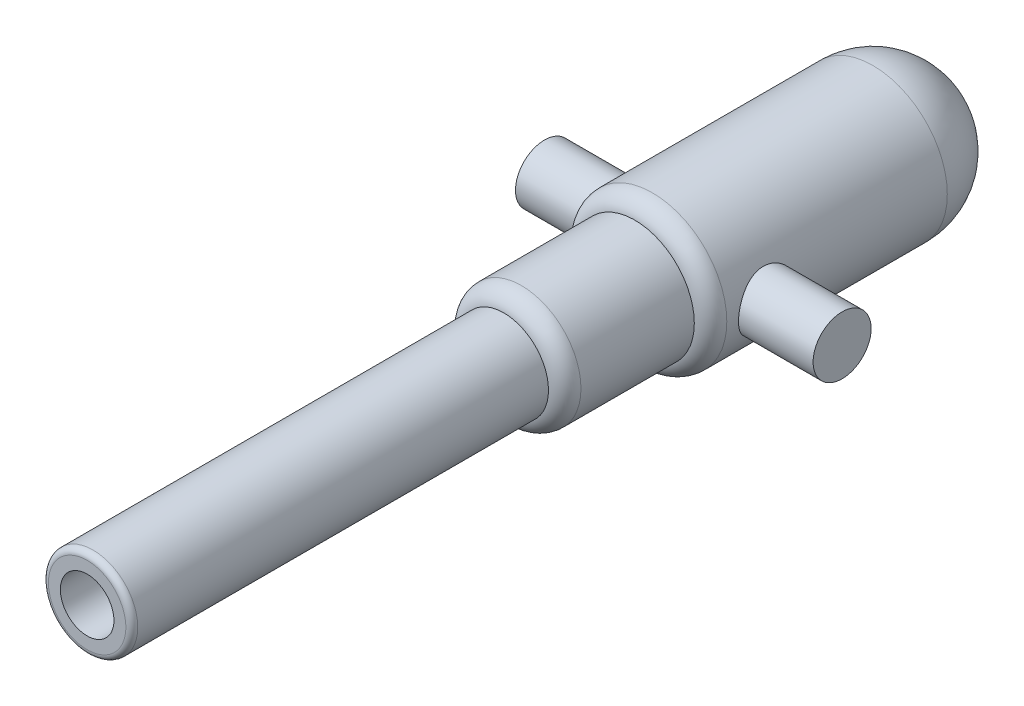
ISO-10303-21;
HEADER;
FILE_DESCRIPTION(('STEP AP214'),'2;1');
FILE_NAME('part.step','',(''),(''),'','','');
FILE_SCHEMA(('AUTOMOTIVE_DESIGN { 1 0 10303 214 1 1 1 1 }'));
ENDSEC;
DATA;
#1=APPLICATION_CONTEXT('core data for automotive mechanical design processes');
#2=APPLICATION_PROTOCOL_DEFINITION('international standard','automotive_design',2000,#1);
#3=PRODUCT_CONTEXT('',#1,'mechanical');
#4=PRODUCT('Part','Part','',(#3));
#5=PRODUCT_RELATED_PRODUCT_CATEGORY('part','',(#4));
#6=PRODUCT_DEFINITION_FORMATION('','',#4);
#7=PRODUCT_DEFINITION_CONTEXT('part definition',#1,'design');
#8=PRODUCT_DEFINITION('design','',#6,#7);
#9=PRODUCT_DEFINITION_SHAPE('','',#8);
#10=(LENGTH_UNIT() NAMED_UNIT(*) SI_UNIT(.MILLI.,.METRE.));
#11=(NAMED_UNIT(*) PLANE_ANGLE_UNIT() SI_UNIT($,.RADIAN.));
#12=(NAMED_UNIT(*) SI_UNIT($,.STERADIAN.) SOLID_ANGLE_UNIT());
#13=UNCERTAINTY_MEASURE_WITH_UNIT(LENGTH_MEASURE(1.E-05),#10,'distance_accuracy_value','');
#14=(GEOMETRIC_REPRESENTATION_CONTEXT(3) GLOBAL_UNCERTAINTY_ASSIGNED_CONTEXT((#13)) GLOBAL_UNIT_ASSIGNED_CONTEXT((#10,
#11,#12)) REPRESENTATION_CONTEXT('',''));
#15=CARTESIAN_POINT('',(0.,0.,0.));
#16=DIRECTION('',(0.,0.,1.));
#17=DIRECTION('',(1.,0.,0.));
#18=AXIS2_PLACEMENT_3D('',#15,#16,#17);
#19=CARTESIAN_POINT('',(0.,7.49999999999998,132.));
#20=DIRECTION('',(0.,0.,-1.));
#21=DIRECTION('',(-1.,0.,0.));
#22=AXIS2_PLACEMENT_3D('',#19,#20,#21);
#23=PLANE('',#22);
#24=CARTESIAN_POINT('',(0.,0.,132.));
#25=DIRECTION('',(0.,0.,-1.));
#26=DIRECTION('',(-1.,0.,0.));
#27=AXIS2_PLACEMENT_3D('',#24,#25,#26);
#28=CIRCLE('',#27,6.49999999999999);
#29=CARTESIAN_POINT('',(-6.49999999999999,0.,132.));
#30=VERTEX_POINT('',#29);
#31=EDGE_CURVE('E46',#30,#30,#28,.F.);
#32=ORIENTED_EDGE('',*,*,#31,.T.);
#33=EDGE_LOOP('',(#32));
#34=FACE_BOUND('',#33,.T.);
#35=CARTESIAN_POINT('',(0.,0.,132.));
#36=DIRECTION('',(0.,0.,1.));
#37=DIRECTION('',(1.,0.,0.));
#38=AXIS2_PLACEMENT_3D('',#35,#36,#37);
#39=CIRCLE('',#38,4.49999999999998);
#40=CARTESIAN_POINT('',(4.49999999999998,0.,132.));
#41=VERTEX_POINT('',#40);
#42=EDGE_CURVE('E138',#41,#41,#39,.T.);
#43=ORIENTED_EDGE('',*,*,#42,.F.);
#44=EDGE_LOOP('',(#43));
#45=FACE_BOUND('',#44,.T.);
#46=ADVANCED_FACE('F39',(#34,#45),#23,.F.);
#47=CARTESIAN_POINT('',(0.,0.,132.));
#48=DIRECTION('',(0.,0.,1.));
#49=DIRECTION('',(1.,0.,0.));
#50=AXIS2_PLACEMENT_3D('',#47,#48,#49);
#51=CYLINDRICAL_SURFACE('',#50,7.49999999999999);
#52=CARTESIAN_POINT('',(0.,0.,131.));
#53=DIRECTION('',(0.,0.,-1.));
#54=DIRECTION('',(-1.,0.,0.));
#55=AXIS2_PLACEMENT_3D('',#52,#53,#54);
#56=CIRCLE('',#55,7.49999999999999);
#57=CARTESIAN_POINT('',(-7.49999999999999,0.,131.));
#58=VERTEX_POINT('',#57);
#59=EDGE_CURVE('E10',#58,#58,#56,.T.);
#60=ORIENTED_EDGE('',*,*,#59,.T.);
#61=EDGE_LOOP('',(#60));
#62=FACE_BOUND('',#61,.T.);
#63=CARTESIAN_POINT('',(0.,0.,62.));
#64=DIRECTION('',(0.,0.,1.));
#65=DIRECTION('',(1.,0.,0.));
#66=AXIS2_PLACEMENT_3D('',#63,#64,#65);
#67=CIRCLE('',#66,7.49999999999999);
#68=CARTESIAN_POINT('',(7.49999999999999,0.,62.));
#69=VERTEX_POINT('',#68);
#70=EDGE_CURVE('E117',#69,#69,#67,.T.);
#71=ORIENTED_EDGE('',*,*,#70,.T.);
#72=EDGE_LOOP('',(#71));
#73=FACE_BOUND('',#72,.T.);
#74=ADVANCED_FACE('F99',(#62,#73),#51,.T.);
#75=CARTESIAN_POINT('',(0.,0.,132.));
#76=DIRECTION('',(0.,0.,1.));
#77=DIRECTION('',(1.,0.,0.));
#78=AXIS2_PLACEMENT_3D('',#75,#76,#77);
#79=CYLINDRICAL_SURFACE('',#78,9.99999999999999);
#80=CARTESIAN_POINT('',(0.,0.,59.0419601084502));
#81=DIRECTION('',(0.,0.,1.));
#82=DIRECTION('',(1.,0.,0.));
#83=AXIS2_PLACEMENT_3D('',#80,#81,#82);
#84=CIRCLE('',#83,9.99999999999999);
#85=CARTESIAN_POINT('',(9.99999999999999,0.,59.0419601084502));
#86=VERTEX_POINT('',#85);
#87=EDGE_CURVE('E49',#86,#86,#84,.F.);
#88=ORIENTED_EDGE('',*,*,#87,.T.);
#89=EDGE_LOOP('',(#88));
#90=FACE_BOUND('',#89,.T.);
#91=CARTESIAN_POINT('',(0.,0.,40.));
#92=DIRECTION('',(0.,0.,1.));
#93=DIRECTION('',(1.,0.,0.));
#94=AXIS2_PLACEMENT_3D('',#91,#92,#93);
#95=CIRCLE('',#94,10.);
#96=CARTESIAN_POINT('',(10.,0.,40.));
#97=VERTEX_POINT('',#96);
#98=EDGE_CURVE('E119',#97,#97,#95,.T.);
#99=ORIENTED_EDGE('',*,*,#98,.T.);
#100=EDGE_LOOP('',(#99));
#101=FACE_BOUND('',#100,.T.);
#102=ADVANCED_FACE('F98',(#90,#101),#79,.T.);
#103=CARTESIAN_POINT('',(0.,0.,132.));
#104=DIRECTION('',(0.,0.,1.));
#105=DIRECTION('',(1.,0.,0.));
#106=AXIS2_PLACEMENT_3D('',#103,#104,#105);
#107=CYLINDRICAL_SURFACE('',#106,12.5);
#108=CARTESIAN_POINT('',(12.5,0.,25.3381575751629));
#109=CARTESIAN_POINT('',(12.4999994597244,-0.129226838972536,25.3211703991597));
#110=CARTESIAN_POINT('',(12.4979905510534,-0.259185516908951,25.3093647696698));
#111=CARTESIAN_POINT('',(12.4898775535801,-0.519561942138447,25.2962041612993));
#112=CARTESIAN_POINT('',(12.4837707889129,-0.649979933969831,25.2948560182969));
#113=CARTESIAN_POINT('',(12.4674780364061,-0.910527070688841,25.3025953336481));
#114=CARTESIAN_POINT('',(12.4572836387743,-1.04065506047694,25.3117043787842));
#115=CARTESIAN_POINT('',(12.4329539413304,-1.29944605129971,25.3402569231002));
#116=CARTESIAN_POINT('',(12.4188170641594,-1.42810844446937,25.3597045615084));
#117=CARTESIAN_POINT('',(12.3868963012593,-1.68261247999733,25.4086240158509));
#118=CARTESIAN_POINT('',(12.3691245157154,-1.80846198276566,25.4380627815141));
#119=CARTESIAN_POINT('',(12.3302366100126,-2.05696943035583,25.506663265585));
#120=CARTESIAN_POINT('',(12.3091192395738,-2.17962616197389,25.5458286220394));
#121=CARTESIAN_POINT('',(12.2413629902609,-2.54145637069845,25.6773262486514));
#122=CARTESIAN_POINT('',(12.1902734123955,-2.77484898664491,25.7837301216748));
#123=CARTESIAN_POINT('',(12.0780913987194,-3.22902944503434,26.0353089074961));
#124=CARTESIAN_POINT('',(12.0166937581669,-3.4490068755474,26.1817978096245));
#125=CARTESIAN_POINT('',(11.8903993949058,-3.86200516215904,26.5077136651735));
#126=CARTESIAN_POINT('',(11.8255007148415,-4.0550107177772,26.6871591815814));
#127=CARTESIAN_POINT('',(11.6936075623931,-4.42152728806899,27.08789333244));
#128=CARTESIAN_POINT('',(11.6267481478334,-4.59297624432979,27.3111350291765));
#129=CARTESIAN_POINT('',(11.5335933617645,-4.8200574486726,27.6667662658331));
#130=CARTESIAN_POINT('',(11.5037161733471,-4.89076679489595,27.7888452488292));
#131=CARTESIAN_POINT('',(11.4472138374616,-5.02158971850734,28.0392495717925));
#132=CARTESIAN_POINT('',(11.4205871146224,-5.0817084350615,28.1675718433722));
#133=CARTESIAN_POINT('',(11.3719157267365,-5.18969922570016,28.4270755624311));
#134=CARTESIAN_POINT('',(11.3497916934938,-5.2377876484485,28.5581521440615));
#135=CARTESIAN_POINT('',(11.3102297645343,-5.32267765976673,28.8245411741977));
#136=CARTESIAN_POINT('',(11.2927896148228,-5.35948467842179,28.9598515501742));
#137=CARTESIAN_POINT('',(11.2632129766332,-5.42136626623145,29.2336237360242));
#138=CARTESIAN_POINT('',(11.2510735418959,-5.44644735347768,29.3720837501123));
#139=CARTESIAN_POINT('',(11.2325430962287,-5.48456279544931,29.6510292526751));
#140=CARTESIAN_POINT('',(11.2261515112001,-5.49759835329317,29.7915145374402));
#141=CARTESIAN_POINT('',(11.2196856668002,-5.51078004946016,30.0598083721302));
#142=CARTESIAN_POINT('',(11.2190680158967,-5.51203493370522,30.187550773587));
#143=CARTESIAN_POINT('',(11.2227579904903,-5.50451831612154,30.4427134883956));
#144=CARTESIAN_POINT('',(11.2270672242806,-5.49574354029019,30.5701336829577));
#145=CARTESIAN_POINT('',(11.2404729555602,-5.46827206844951,30.8235912086965));
#146=CARTESIAN_POINT('',(11.2495676013329,-5.44957921022185,30.9496290555288));
#147=CARTESIAN_POINT('',(11.2722616971408,-5.40248073501962,31.1995087574529));
#148=CARTESIAN_POINT('',(11.2858628792094,-5.3740713834912,31.3233497488994));
#149=CARTESIAN_POINT('',(11.3167403370463,-5.30873391127403,31.5646582466844));
#150=CARTESIAN_POINT('',(11.3339076493822,-5.27205609886384,31.6822075696039));
#151=CARTESIAN_POINT('',(11.3716585017226,-5.19012654900064,31.9137290997309));
#152=CARTESIAN_POINT('',(11.3922432260962,-5.14487183828767,32.0277000504447));
#153=CARTESIAN_POINT('',(11.4583532922518,-4.9967839280586,32.3632768653571));
#154=CARTESIAN_POINT('',(11.5082561126269,-4.88158315603705,32.5787067781774));
#155=CARTESIAN_POINT('',(11.619473573769,-4.61095297204907,33.0052076968856));
#156=CARTESIAN_POINT('',(11.6813841823322,-4.45302718832601,33.2145236564944));
#157=CARTESIAN_POINT('',(11.8078074883167,-4.10605422073201,33.604978120563));
#158=CARTESIAN_POINT('',(11.8723214198585,-3.9169921425007,33.7861030585137));
#159=CARTESIAN_POINT('',(11.969202611314,-3.60572300907301,34.0397118398778));
#160=CARTESIAN_POINT('',(12.0026407593194,-3.49302534900618,34.1237048207036));
#161=CARTESIAN_POINT('',(12.0678824647639,-3.26048571842857,34.2818337991373));
#162=CARTESIAN_POINT('',(12.0996866075066,-3.14064633978999,34.3559733415794));
#163=CARTESIAN_POINT('',(12.1609212130946,-2.89449311015712,34.4938401059582));
#164=CARTESIAN_POINT('',(12.1903509036671,-2.76817717438356,34.5575639471243));
#165=CARTESIAN_POINT('',(12.2461218580143,-2.50996634180787,34.6739759969793));
#166=CARTESIAN_POINT('',(12.272464566413,-2.37807409420981,34.7266693767768));
#167=CARTESIAN_POINT('',(12.3208990524423,-2.11263582598567,34.8194418084597));
#168=CARTESIAN_POINT('',(12.3430740137156,-1.9791959647019,34.8597809289627));
#169=CARTESIAN_POINT('',(12.3833986325649,-1.70883202868704,34.9289680525723));
#170=CARTESIAN_POINT('',(12.4015500742392,-1.57190952836341,34.9578211533148));
#171=CARTESIAN_POINT('',(12.433450973,-1.29561954731249,35.0036871318749));
#172=CARTESIAN_POINT('',(12.4472014554766,-1.15625264410628,35.0207027688179));
#173=CARTESIAN_POINT('',(12.470044821386,-0.876193659938018,35.0426470455143));
#174=CARTESIAN_POINT('',(12.4791380051482,-0.73550166502149,35.047576464734));
#175=CARTESIAN_POINT('',(12.4920699791984,-0.464028032443197,35.0453140593877));
#176=CARTESIAN_POINT('',(12.4962368930579,-0.333254283511071,35.0389605897774));
#177=CARTESIAN_POINT('',(12.5004696627911,-0.0725305873693478,35.0157391287691));
#178=CARTESIAN_POINT('',(12.5005341517267,0.0574190708300672,34.9988676346303));
#179=CARTESIAN_POINT('',(12.496685510731,0.31542024633806,34.9547416807325));
#180=CARTESIAN_POINT('',(12.4927741896331,0.443472599963976,34.9274919461807));
#181=CARTESIAN_POINT('',(12.4812052069073,0.696857661971225,34.8628247605715));
#182=CARTESIAN_POINT('',(12.473546135218,0.822189328165207,34.8254034849102));
#183=CARTESIAN_POINT('',(12.4549792961256,1.06689125418272,34.7415037843037));
#184=CARTESIAN_POINT('',(12.4441353638004,1.18632930976024,34.6952090155042));
#185=CARTESIAN_POINT('',(12.4195336871626,1.42096072887096,34.5934976201856));
#186=CARTESIAN_POINT('',(12.4057749089489,1.53615256919845,34.5380777585377));
#187=CARTESIAN_POINT('',(12.3607746687488,1.87423836946384,34.3587375563957));
#188=CARTESIAN_POINT('',(12.3257934791538,2.08983617387784,34.221669835569));
#189=CARTESIAN_POINT('',(12.2481528769978,2.50595214749395,33.9090307917687));
#190=CARTESIAN_POINT('',(12.2052075575475,2.70526663077226,33.7319391185408));
#191=CARTESIAN_POINT('',(12.1180042761095,3.07239432473198,33.3478197296124));
#192=CARTESIAN_POINT('',(12.0737458698894,3.24019673048771,33.1407817887921));
#193=CARTESIAN_POINT('',(11.9873924261093,3.54667850493966,32.6920629056526));
#194=CARTESIAN_POINT('',(11.9454729759602,3.6837900016405,32.4492730768139));
#195=CARTESIAN_POINT('',(11.8716964383452,3.9150547198657,31.9426042092476));
#196=CARTESIAN_POINT('',(11.8398365910524,4.00921972680856,31.6787309796352));
#197=CARTESIAN_POINT('',(11.7914772619379,4.14927315944983,31.1446036141269));
#198=CARTESIAN_POINT('',(11.7745929634391,4.19637523222956,30.8747040866559));
#199=CARTESIAN_POINT('',(11.7572731348476,4.24467197143962,30.3303460923893));
#200=CARTESIAN_POINT('',(11.7568318285848,4.24588275877488,30.0558892604005));
#201=CARTESIAN_POINT('',(11.7720441162792,4.20349629131691,29.5249187891053));
#202=CARTESIAN_POINT('',(11.7868884713428,4.16215199469008,29.2681974793152));
#203=CARTESIAN_POINT('',(11.8294389074607,4.03962105287876,28.7655746708951));
#204=CARTESIAN_POINT('',(11.8571469711693,3.95842826582611,28.5196748465546));
#205=CARTESIAN_POINT('',(11.9224140548328,3.75730096551356,28.041257709826));
#206=CARTESIAN_POINT('',(11.9601159984523,3.63679798438447,27.8089996775273));
#207=CARTESIAN_POINT('',(12.0405798398751,3.36081584419462,27.3673157780759));
#208=CARTESIAN_POINT('',(12.0833427508106,3.20532967637435,27.1578944986867));
#209=CARTESIAN_POINT('',(12.1713464162943,2.85355872164059,26.7557394209411));
#210=CARTESIAN_POINT('',(12.2165955938819,2.65551660144719,26.5645299182113));
#211=CARTESIAN_POINT('',(12.2802508191089,2.33608940462232,26.3044174060929));
#212=CARTESIAN_POINT('',(12.3007823954991,2.22577903743012,26.2221026803681));
#213=CARTESIAN_POINT('',(12.3397672802885,1.99835539436917,26.0669511504512));
#214=CARTESIAN_POINT('',(12.3582214518886,1.8812449749413,25.9941104076706));
#215=CARTESIAN_POINT('',(12.3924855637603,1.64047371343002,25.8581908408109));
#216=CARTESIAN_POINT('',(12.4082842031198,1.51678768503403,25.7951538184922));
#217=CARTESIAN_POINT('',(12.4365542307122,1.26421990341541,25.6797619218649));
#218=CARTESIAN_POINT('',(12.4490271036679,1.13534049835377,25.6274022833124));
#219=CARTESIAN_POINT('',(12.4701225420702,0.873634619935997,25.5339301786789));
#220=CARTESIAN_POINT('',(12.4787547694952,0.740818958260319,25.4927895908399));
#221=CARTESIAN_POINT('',(12.4918078911273,0.472029113594252,25.4219902806105));
#222=CARTESIAN_POINT('',(12.4962319743048,0.336057402466485,25.3923228738718));
#223=CARTESIAN_POINT('',(12.4989413694362,0.166019843566311,25.3627793942062));
#224=CARTESIAN_POINT('',(12.4993376429333,0.132890129883392,25.3573755232544));
#225=CARTESIAN_POINT('',(12.4998670314448,0.066523130927692,25.3472523559209));
#226=CARTESIAN_POINT('',(12.5000001391625,0.033285842697772,25.3425330785244));
#227=CARTESIAN_POINT('',(12.5,0.,25.3381575751629));
#228=B_SPLINE_CURVE_WITH_KNOTS('',3,(#108,#109,#110,#111,#112,#113,#114,#115,#116,#117,#118,
#119,#120,#121,#122,#123,#124,#125,#126,#127,#128,#129,#130,#131,#132,#133,#134,#135,#136,#137,
#138,#139,#140,#141,#142,#143,#144,#145,#146,#147,#148,#149,#150,#151,#152,#153,#154,#155,#156,
#157,#158,#159,#160,#161,#162,#163,#164,#165,#166,#167,#168,#169,#170,#171,#172,#173,#174,#175,
#176,#177,#178,#179,#180,#181,#182,#183,#184,#185,#186,#187,#188,#189,#190,#191,#192,#193,#194,
#195,#196,#197,#198,#199,#200,#201,#202,#203,#204,#205,#206,#207,#208,#209,#210,#211,#212,#213,
#214,#215,#216,#217,#218,#219,#220,#221,#222,#223,#224,#225,#226,#227),.UNSPECIFIED.,.T.,.F.,(4,
2,2,2,2,2,2,2,2,2,2,2,2,2,2,2,2,2,2,2,2,2,2,2,2,2,2,2,2,2,2,2,2,2,2,2,2,2,2,2,2,2,2,2,2,2,2,2,2,
2,2,2,2,2,2,2,2,2,2,4),(0.,0.390981668001859,0.78221889244213,1.17426520270685,1.56646859358783,
1.95738703536964,2.34845191357281,3.12948834955925,3.94006011707391,4.75108985148657,
5.61446222423409,6.04663007437252,6.47858763132611,6.90210459388154,7.32541738346282,
7.7484945856333,8.171529525898,8.55429906082968,8.93719357970137,9.31994004625912,
9.70283378782229,10.0754049745614,10.4481055535206,11.1930101526671,11.9980342131282,
12.8034444895192,13.2364398862315,13.6692790861069,14.1022585008805,14.5350344769447,
14.9579493450719,15.3806763085937,15.803304708112,16.2259058506936,16.6184062530595,
17.0110374368413,17.4034900691569,17.7960904723207,18.181304151712,18.5666546965442,
19.3367468822825,20.1434392477604,20.950407710544,21.7921742426247,22.6337096370977,
23.4529356909605,24.2718739606034,25.0495797377532,25.827405420753,26.617018727879,
27.4067903723694,28.2394604132957,28.6565325403842,29.0734307214053,29.4920604493885,
29.9105029742729,30.3278867801145,30.7449540360657,30.8456590720492,30.946366900255),.UNSPECIFIED.);
#229=CARTESIAN_POINT('',(12.5,0.,25.3381575751629));
#230=VERTEX_POINT('',#229);
#231=EDGE_CURVE('E60',#230,#230,#228,.T.);
#232=ORIENTED_EDGE('',*,*,#231,.T.);
#233=EDGE_LOOP('',(#232));
#234=FACE_BOUND('',#233,.T.);
#235=CARTESIAN_POINT('',(-12.4838406935988,-0.635390853606489,25.2965728752538));
#236=CARTESIAN_POINT('',(-12.4904556713871,-0.505412139555741,25.2965736003361));
#237=CARTESIAN_POINT('',(-12.495038744393,-0.375280911729329,25.3017781315438));
#238=CARTESIAN_POINT('',(-12.5001392354246,-0.115715806595469,25.3226004446549));
#239=CARTESIAN_POINT('',(-12.5006540237285,0.0137175656209384,25.3382249549144));
#240=CARTESIAN_POINT('',(-12.4977229965279,0.271144570874731,25.3798248331102));
#241=CARTESIAN_POINT('',(-12.4942690073285,0.399134682478056,25.405821490389));
#242=CARTESIAN_POINT('',(-12.4836018752876,0.652514583572436,25.4679623818925));
#243=CARTESIAN_POINT('',(-12.4763872295543,0.777903312612416,25.5041106704031));
#244=CARTESIAN_POINT('',(-12.4585345925842,1.02478188365609,25.5861273532564));
#245=CARTESIAN_POINT('',(-12.4479072525727,1.14628257978126,25.6319653552776));
#246=CARTESIAN_POINT('',(-12.4236143263625,1.38500451846538,25.73305292795));
#247=CARTESIAN_POINT('',(-12.4099476030955,1.50222414026756,25.7883060190811));
#248=CARTESIAN_POINT('',(-12.3650701408506,1.84615507941922,25.9675011746057));
#249=CARTESIAN_POINT('',(-12.3299549790499,2.06548519240017,26.1049950373328));
#250=CARTESIAN_POINT('',(-12.2523010865487,2.48564046410375,26.4171549267975));
#251=CARTESIAN_POINT('',(-12.2095571263636,2.68562580985688,26.5928896112891));
#252=CARTESIAN_POINT('',(-12.1225591171208,3.05441941037382,26.9745048371584));
#253=CARTESIAN_POINT('',(-12.0783044557223,3.22321484063623,27.1803977167192));
#254=CARTESIAN_POINT('',(-12.0138553633235,3.45311673528246,27.5128068508752));
#255=CARTESIAN_POINT('',(-11.9922582479076,3.52717079980072,27.6303080492907));
#256=CARTESIAN_POINT('',(-11.950826403208,3.66509569941948,27.8714210617199));
#257=CARTESIAN_POINT('',(-11.9309909980385,3.72897044738334,27.9950305037112));
#258=CARTESIAN_POINT('',(-11.8937673669754,3.84604697170585,28.2475862782362));
#259=CARTESIAN_POINT('',(-11.8763796564707,3.89924650128039,28.3765337273714));
#260=CARTESIAN_POINT('',(-11.8446896003166,3.99447716484654,28.6387987365597));
#261=CARTESIAN_POINT('',(-11.8303858598779,4.03651334969358,28.772114289487));
#262=CARTESIAN_POINT('',(-11.8057014515689,4.10813995370401,29.0388198530282));
#263=CARTESIAN_POINT('',(-11.7952320029605,4.1380140957391,29.1721254264754));
#264=CARTESIAN_POINT('',(-11.7781159259837,4.18648393265259,29.4409605561998));
#265=CARTESIAN_POINT('',(-11.7714677014391,4.20508433689813,29.5764891595198));
#266=CARTESIAN_POINT('',(-11.7622388492292,4.23083031338338,29.8487536420786));
#267=CARTESIAN_POINT('',(-11.7596577666973,4.2379771665822,29.9854893845914));
#268=CARTESIAN_POINT('',(-11.7586607568188,4.2407428918501,30.2590900340619));
#269=CARTESIAN_POINT('',(-11.7602446824097,4.23636217094721,30.3959549362885));
#270=CARTESIAN_POINT('',(-11.7673298735739,4.21663943814865,30.6617442850613));
#271=CARTESIAN_POINT('',(-11.7726267964856,4.20186907286246,30.7907170604826));
#272=CARTESIAN_POINT('',(-11.786735351013,4.16212848848435,31.0469280876284));
#273=CARTESIAN_POINT('',(-11.7955481632626,4.13715484306821,31.1741657418422));
#274=CARTESIAN_POINT('',(-11.8163933732626,4.07723599715207,31.4259695412345));
#275=CARTESIAN_POINT('',(-11.8284249074806,4.04229347097915,31.5505363932796));
#276=CARTESIAN_POINT('',(-11.8553142319127,3.96273622118073,31.7962443056449));
#277=CARTESIAN_POINT('',(-11.8701731022335,3.9181178002308,31.9173840363449));
#278=CARTESIAN_POINT('',(-11.9187420384117,3.76891110169501,32.2777075351918));
#279=CARTESIAN_POINT('',(-11.956157630835,3.6497468175885,32.5105483894963));
#280=CARTESIAN_POINT('',(-12.0362074456665,3.37637714888558,32.9535207475384));
#281=CARTESIAN_POINT('',(-12.0788432934737,3.22216083748824,33.1636451396475));
#282=CARTESIAN_POINT('',(-12.1667678644494,2.8729540040032,33.5674786257397));
#283=CARTESIAN_POINT('',(-12.2120740852076,2.67619403439611,33.7596602224037));
#284=CARTESIAN_POINT('',(-12.2972783187395,2.25246143460713,34.1087415835048));
#285=CARTESIAN_POINT('',(-12.3371760206977,2.02548706955545,34.265639320598));
#286=CARTESIAN_POINT('',(-12.4063876292586,1.54607535453546,34.5400240303445));
#287=CARTESIAN_POINT('',(-12.4356594486361,1.29354170860635,34.6573541553194));
#288=CARTESIAN_POINT('',(-12.4789443905752,0.77104437676312,34.8475502560872));
#289=CARTESIAN_POINT('',(-12.492964500218,0.501088732273862,34.9204365856471));
#290=CARTESIAN_POINT('',(-12.5026514032372,-0.0326828152323721,35.0163504499959));
#291=CARTESIAN_POINT('',(-12.4992746612975,-0.296034466207802,35.0418734472789));
#292=CARTESIAN_POINT('',(-12.4756851618254,-0.822617331403068,35.0500853846972));
#293=CARTESIAN_POINT('',(-12.4554748727356,-1.08584855761963,35.0327806042917));
#294=CARTESIAN_POINT('',(-12.4001326402504,-1.59721358129429,34.9575416191449));
#295=CARTESIAN_POINT('',(-12.3654286049026,-1.84556357216712,34.9007437188156));
#296=CARTESIAN_POINT('',(-12.2836410442436,-2.32856693105758,34.7500905624531));
#297=CARTESIAN_POINT('',(-12.2365552696965,-2.563217801053,34.6562285718934));
#298=CARTESIAN_POINT('',(-12.131173172961,-3.02372394429368,34.4295361961517));
#299=CARTESIAN_POINT('',(-12.0724710281355,-3.24872232186301,34.2951567376692));
#300=CARTESIAN_POINT('',(-11.9500677004362,-3.67353403891935,33.9930084802113));
#301=CARTESIAN_POINT('',(-11.886364213276,-3.87333565760833,33.8252242351987));
#302=CARTESIAN_POINT('',(-11.7547988361835,-4.25658367641108,33.4472096733979));
#303=CARTESIAN_POINT('',(-11.6869520153664,-4.43796260688953,33.234854818549));
#304=CARTESIAN_POINT('',(-11.5906041740214,-4.68140624631176,32.8946074485749));
#305=CARTESIAN_POINT('',(-11.5593738926326,-4.75782266075944,32.7774913730524));
#306=CARTESIAN_POINT('',(-11.4995861651321,-4.90056028192241,32.5366347175396));
#307=CARTESIAN_POINT('',(-11.4710275047463,-4.96688608357517,32.4128971876528));
#308=CARTESIAN_POINT('',(-11.4175059962435,-5.0887110723098,32.1598487353626));
#309=CARTESIAN_POINT('',(-11.3925344466843,-5.14423657830732,32.0305523234428));
#310=CARTESIAN_POINT('',(-11.3469222567405,-5.24407939862449,31.7670208543385));
#311=CARTESIAN_POINT('',(-11.3262795812997,-5.28840198159524,31.632788152806));
#312=CARTESIAN_POINT('',(-11.2900436484373,-5.36532617169036,31.3604172191281));
#313=CARTESIAN_POINT('',(-11.2744474976735,-5.39793449617909,31.2222812744197));
#314=CARTESIAN_POINT('',(-11.2488720111282,-5.45103219698156,30.9431905655546));
#315=CARTESIAN_POINT('',(-11.2388920688456,-5.47152288190581,30.8022361074756));
#316=CARTESIAN_POINT('',(-11.2255772560534,-5.49878344762201,30.5318145151358));
#317=CARTESIAN_POINT('',(-11.22171610544,-5.50664097541377,30.4024817967111));
#318=CARTESIAN_POINT('',(-11.2190699114718,-5.51203058476903,30.1435023491708));
#319=CARTESIAN_POINT('',(-11.2202865403807,-5.5095592647355,30.0138555306632));
#320=CARTESIAN_POINT('',(-11.227758077188,-5.49431699996822,29.7553822672614));
#321=CARTESIAN_POINT('',(-11.234010495899,-5.48155114381262,29.6265554487436));
#322=CARTESIAN_POINT('',(-11.2513476871422,-5.44587615574511,29.3705977654933));
#323=CARTESIAN_POINT('',(-11.2624342953865,-5.42296317055933,29.2434675639449));
#324=CARTESIAN_POINT('',(-11.2884864301119,-5.3685138641897,28.9975614827472));
#325=CARTESIAN_POINT('',(-11.3032540036095,-5.33741407624805,28.8786677040832));
#326=CARTESIAN_POINT('',(-11.336464372761,-5.2665074547809,28.644016906501));
#327=CARTESIAN_POINT('',(-11.3549084316993,-5.22669762792175,28.5282609813609));
#328=CARTESIAN_POINT('',(-11.4150475620875,-5.09471163411512,28.1867402279716));
#329=CARTESIAN_POINT('',(-11.4615684788221,-4.98994120514739,27.966554008105));
#330=CARTESIAN_POINT('',(-11.5666240762398,-4.74157552050007,27.5311033056615));
#331=CARTESIAN_POINT('',(-11.6257698951164,-4.59578411495976,27.3172501468443));
#332=CARTESIAN_POINT('',(-11.7482355015239,-4.27303044735824,26.9158713175878));
#333=CARTESIAN_POINT('',(-11.8115568347765,-4.09605660096241,26.7283554782006));
#334=CARTESIAN_POINT('',(-11.942301021431,-3.69845973642234,26.3688379424397));
#335=CARTESIAN_POINT('',(-12.0096256747784,-3.47542769830342,26.1994331826888));
#336=CARTESIAN_POINT('',(-12.1048280209788,-3.12062005440072,25.975272831145));
#337=CARTESIAN_POINT('',(-12.1356224829998,-2.99885858457035,25.9054958464596));
#338=CARTESIAN_POINT('',(-12.1945821193644,-2.74928407585095,25.776487226759));
#339=CARTESIAN_POINT('',(-12.2227484699752,-2.62147378322273,25.7172508631918));
#340=CARTESIAN_POINT('',(-12.2756288700004,-2.36144787965335,25.6102131249247));
#341=CARTESIAN_POINT('',(-12.300363638408,-2.22926526493515,25.5623417591918));
#342=CARTESIAN_POINT('',(-12.3460177729246,-1.96070888056114,25.4780723753239));
#343=CARTESIAN_POINT('',(-12.3669389352103,-1.8243371195089,25.4416689499706));
#344=CARTESIAN_POINT('',(-12.4044608685085,-1.54875522393969,25.3808260813251));
#345=CARTESIAN_POINT('',(-12.4210728674132,-1.40955350603785,25.3563553966737));
#346=CARTESIAN_POINT('',(-12.449692152096,-1.12915628088505,25.3195850484128));
#347=CARTESIAN_POINT('',(-12.4617030437156,-0.98796242520435,25.3072758419788));
#348=CARTESIAN_POINT('',(-12.4736956315297,-0.811271759583763,25.2996194938797));
#349=CARTESIAN_POINT('',(-12.4759320670516,-0.776118934768419,25.2984775303959));
#350=CARTESIAN_POINT('',(-12.4801089093854,-0.705778086748445,25.296954112483));
#351=CARTESIAN_POINT('',(-12.4820493080831,-0.670590062605619,25.2965726788961));
#352=CARTESIAN_POINT('',(-12.4838406935988,-0.635390853606489,25.2965728752538));
#353=B_SPLINE_CURVE_WITH_KNOTS('',3,(#235,#236,#237,#238,#239,#240,#241,#242,#243,#244,#245,
#246,#247,#248,#249,#250,#251,#252,#253,#254,#255,#256,#257,#258,#259,#260,#261,#262,#263,#264,
#265,#266,#267,#268,#269,#270,#271,#272,#273,#274,#275,#276,#277,#278,#279,#280,#281,#282,#283,
#284,#285,#286,#287,#288,#289,#290,#291,#292,#293,#294,#295,#296,#297,#298,#299,#300,#301,#302,
#303,#304,#305,#306,#307,#308,#309,#310,#311,#312,#313,#314,#315,#316,#317,#318,#319,#320,#321,
#322,#323,#324,#325,#326,#327,#328,#329,#330,#331,#332,#333,#334,#335,#336,#337,#338,#339,#340,
#341,#342,#343,#344,#345,#346,#347,#348,#349,#350,#351,#352),.UNSPECIFIED.,.T.,.F.,(4,2,2,2,2,2,
2,2,2,2,2,2,2,2,2,2,2,2,2,2,2,2,2,2,2,2,2,2,2,2,2,2,2,2,2,2,2,2,2,2,2,2,2,2,2,2,2,2,2,2,2,2,2,2,
2,2,2,2,4),(0.,0.390405205015054,0.781062745649908,1.17252628952777,1.5641463962009,
1.95455592227975,2.34511175149461,3.12513680495369,3.93067279664783,4.73653927082414,
5.15779337412619,5.5788851574542,6.00006547407944,6.42105490173997,6.83156632181819,
7.24190614097414,7.65220006473763,8.06247950159472,8.45179057890459,8.84123249686139,
9.23057003827631,9.62005661517884,10.4089630091952,11.1981156678438,12.0304523874065,
12.8628369192509,13.6984833032777,14.5337467013095,15.3235948588911,16.1133272148671,
16.8812297202165,17.6492718173131,18.4515131124803,19.2541262210867,20.1118946859696,
20.5413234543776,20.9705560857627,21.3987292556049,21.8267006825517,22.2544263025355,
22.6821057230514,23.0704916538287,23.4590055017305,23.8473274252827,24.2357969369357,
24.6067095769055,24.9777498872716,25.7193155329358,26.5125390263051,27.3060578273962,
28.1657353951847,28.5963298289539,29.0267306071875,29.4544077102171,29.8818828574729,
30.3082327325375,30.7342477945972,30.8399695500723,30.9456942028051),.UNSPECIFIED.);
#354=CARTESIAN_POINT('',(-12.4838406935988,-0.635390853606489,25.2965728752538));
#355=VERTEX_POINT('',#354);
#356=EDGE_CURVE('E66',#355,#355,#353,.T.);
#357=ORIENTED_EDGE('',*,*,#356,.T.);
#358=EDGE_LOOP('',(#357));
#359=FACE_BOUND('',#358,.T.);
#360=CARTESIAN_POINT('',(0.,0.,37.0419601084502));
#361=DIRECTION('',(0.,0.,1.));
#362=DIRECTION('',(1.,0.,0.));
#363=AXIS2_PLACEMENT_3D('',#360,#361,#362);
#364=CIRCLE('',#363,12.5);
#365=CARTESIAN_POINT('',(12.5,0.,37.0419601084502));
#366=VERTEX_POINT('',#365);
#367=EDGE_CURVE('E53',#366,#366,#364,.F.);
#368=ORIENTED_EDGE('',*,*,#367,.T.);
#369=EDGE_LOOP('',(#368));
#370=FACE_BOUND('',#369,.T.);
#371=CARTESIAN_POINT('',(0.,0.,0.));
#372=DIRECTION('',(0.,0.,1.));
#373=DIRECTION('',(1.,0.,0.));
#374=AXIS2_PLACEMENT_3D('',#371,#372,#373);
#375=CIRCLE('',#374,12.5);
#376=CARTESIAN_POINT('',(12.5,0.,0.));
#377=VERTEX_POINT('',#376);
#378=EDGE_CURVE('E63',#377,#377,#375,.T.);
#379=ORIENTED_EDGE('',*,*,#378,.T.);
#380=EDGE_LOOP('',(#379));
#381=FACE_BOUND('',#380,.T.);
#382=ADVANCED_FACE('F69',(#234,#359,#370,#381),#107,.T.);
#383=CARTESIAN_POINT('',(0.,0.,0.));
#384=DIRECTION('',(0.,0.,1.));
#385=DIRECTION('',(0.,1.,0.));
#386=AXIS2_PLACEMENT_3D('',#383,#384,#385);
#387=SPHERICAL_SURFACE('',#386,12.5);
#388=ORIENTED_EDGE('',*,*,#378,.F.);
#389=EDGE_LOOP('',(#388));
#390=FACE_BOUND('',#389,.T.);
#391=ADVANCED_FACE('F84',(#390),#387,.T.);
#392=CARTESIAN_POINT('',(0.,0.,37.0419601084502));
#393=DIRECTION('',(0.,0.,1.));
#394=DIRECTION('',(1.,0.,0.));
#395=AXIS2_PLACEMENT_3D('',#392,#393,#394);
#396=TOROIDAL_SURFACE('',#395,9.5,3.);
#397=ORIENTED_EDGE('',*,*,#367,.F.);
#398=EDGE_LOOP('',(#397));
#399=FACE_BOUND('',#398,.T.);
#400=ORIENTED_EDGE('',*,*,#98,.F.);
#401=EDGE_LOOP('',(#400));
#402=FACE_BOUND('',#401,.T.);
#403=ADVANCED_FACE('F86',(#399,#402),#396,.T.);
#404=CARTESIAN_POINT('',(0.,0.,59.0419601084502));
#405=DIRECTION('',(0.,0.,1.));
#406=DIRECTION('',(1.,0.,0.));
#407=AXIS2_PLACEMENT_3D('',#404,#405,#406);
#408=TOROIDAL_SURFACE('',#407,6.99999999999999,3.);
#409=ORIENTED_EDGE('',*,*,#87,.F.);
#410=EDGE_LOOP('',(#409));
#411=FACE_BOUND('',#410,.T.);
#412=ORIENTED_EDGE('',*,*,#70,.F.);
#413=EDGE_LOOP('',(#412));
#414=FACE_BOUND('',#413,.T.);
#415=ADVANCED_FACE('F94',(#411,#414),#408,.T.);
#416=CARTESIAN_POINT('',(-25.,-0.635390853606489,30.1715728752538));
#417=DIRECTION('',(1.,0.,0.));
#418=DIRECTION('',(0.,0.,-1.));
#419=AXIS2_PLACEMENT_3D('',#416,#417,#418);
#420=PLANE('',#419);
#421=CARTESIAN_POINT('',(-25.,-0.635390853606489,30.1715728752538));
#422=DIRECTION('',(1.,0.,0.));
#423=DIRECTION('',(0.,0.,-1.));
#424=AXIS2_PLACEMENT_3D('',#421,#422,#423);
#425=CIRCLE('',#424,4.875);
#426=CARTESIAN_POINT('',(-25.,-0.635390853606489,25.2965728752538));
#427=VERTEX_POINT('',#426);
#428=EDGE_CURVE('E126',#427,#427,#425,.T.);
#429=ORIENTED_EDGE('',*,*,#428,.F.);
#430=EDGE_LOOP('',(#429));
#431=FACE_BOUND('',#430,.T.);
#432=ADVANCED_FACE('F82',(#431),#420,.F.);
#433=CARTESIAN_POINT('',(-25.,-0.635390853606489,30.1715728752538));
#434=DIRECTION('',(1.,0.,0.));
#435=DIRECTION('',(0.,0.,-1.));
#436=AXIS2_PLACEMENT_3D('',#433,#434,#435);
#437=CYLINDRICAL_SURFACE('',#436,4.875);
#438=ORIENTED_EDGE('',*,*,#428,.T.);
#439=EDGE_LOOP('',(#438));
#440=FACE_BOUND('',#439,.T.);
#441=ORIENTED_EDGE('',*,*,#356,.F.);
#442=EDGE_LOOP('',(#441));
#443=FACE_BOUND('',#442,.T.);
#444=ADVANCED_FACE('F79',(#440,#443),#437,.T.);
#445=CARTESIAN_POINT('',(25.,-0.635390853606489,30.1715728752538));
#446=DIRECTION('',(1.,0.,0.));
#447=DIRECTION('',(0.,0.,-1.));
#448=AXIS2_PLACEMENT_3D('',#445,#446,#447);
#449=CIRCLE('',#448,4.875);
#450=CARTESIAN_POINT('',(25.,-0.635390853606489,25.2965728752538));
#451=VERTEX_POINT('',#450);
#452=EDGE_CURVE('E135',#451,#451,#449,.T.);
#453=ORIENTED_EDGE('',*,*,#452,.F.);
#454=EDGE_LOOP('',(#453));
#455=FACE_BOUND('',#454,.T.);
#456=ORIENTED_EDGE('',*,*,#231,.F.);
#457=EDGE_LOOP('',(#456));
#458=FACE_BOUND('',#457,.T.);
#459=ADVANCED_FACE('F75',(#455,#458),#437,.T.);
#460=CARTESIAN_POINT('',(25.,-0.635390853606489,30.1715728752538));
#461=DIRECTION('',(1.,0.,0.));
#462=DIRECTION('',(0.,0.,-1.));
#463=AXIS2_PLACEMENT_3D('',#460,#461,#462);
#464=PLANE('',#463);
#465=ORIENTED_EDGE('',*,*,#452,.T.);
#466=EDGE_LOOP('',(#465));
#467=FACE_BOUND('',#466,.T.);
#468=ADVANCED_FACE('F76',(#467),#464,.T.);
#469=CARTESIAN_POINT('',(0.,0.,12.));
#470=DIRECTION('',(0.,0.,1.));
#471=DIRECTION('',(1.,0.,0.));
#472=AXIS2_PLACEMENT_3D('',#469,#470,#471);
#473=CYLINDRICAL_SURFACE('',#472,4.49999999999998);
#474=CARTESIAN_POINT('',(0.,0.,12.));
#475=DIRECTION('',(0.,0.,1.));
#476=DIRECTION('',(1.,0.,0.));
#477=AXIS2_PLACEMENT_3D('',#474,#475,#476);
#478=CIRCLE('',#477,4.49999999999998);
#479=CARTESIAN_POINT('',(4.49999999999998,0.,12.));
#480=VERTEX_POINT('',#479);
#481=EDGE_CURVE('E134',#480,#480,#478,.T.);
#482=ORIENTED_EDGE('',*,*,#481,.F.);
#483=EDGE_LOOP('',(#482));
#484=FACE_BOUND('',#483,.T.);
#485=ORIENTED_EDGE('',*,*,#42,.T.);
#486=EDGE_LOOP('',(#485));
#487=FACE_BOUND('',#486,.T.);
#488=ADVANCED_FACE('F144',(#484,#487),#473,.F.);
#489=CARTESIAN_POINT('',(0.,0.,12.));
#490=DIRECTION('',(0.,0.,1.));
#491=DIRECTION('',(1.,0.,0.));
#492=AXIS2_PLACEMENT_3D('',#489,#490,#491);
#493=PLANE('',#492);
#494=ORIENTED_EDGE('',*,*,#481,.T.);
#495=EDGE_LOOP('',(#494));
#496=FACE_BOUND('',#495,.T.);
#497=ADVANCED_FACE('F145',(#496),#493,.T.);
#498=CARTESIAN_POINT('',(0.,0.,131.));
#499=DIRECTION('',(0.,0.,-1.));
#500=DIRECTION('',(-1.,0.,0.));
#501=AXIS2_PLACEMENT_3D('',#498,#499,#500);
#502=TOROIDAL_SURFACE('',#501,6.49999999999999,1.);
#503=ORIENTED_EDGE('',*,*,#59,.F.);
#504=EDGE_LOOP('',(#503));
#505=FACE_BOUND('',#504,.T.);
#506=ORIENTED_EDGE('',*,*,#31,.F.);
#507=EDGE_LOOP('',(#506));
#508=FACE_BOUND('',#507,.T.);
#509=ADVANCED_FACE('F41',(#505,#508),#502,.T.);
#510=CLOSED_SHELL('',(#46,#74,#102,#382,#391,#403,#415,#432,#444,#459,#468,#488,#497,#509));
#511=MANIFOLD_SOLID_BREP('B2',#510);
#512=ADVANCED_BREP_SHAPE_REPRESENTATION('',(#18,#511),#14);
#513=SHAPE_DEFINITION_REPRESENTATION(#9,#512);
ENDSEC;
END-ISO-10303-21;
